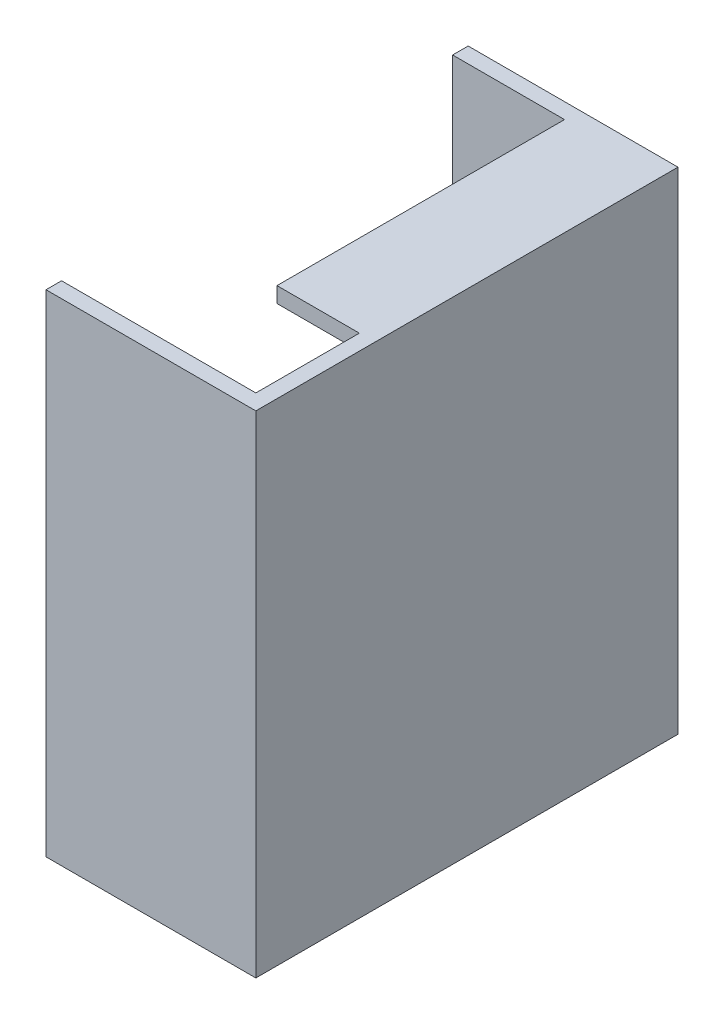
ISO-10303-21;
HEADER;
FILE_DESCRIPTION(('STEP AP214'),'2;1');
FILE_NAME('part.step','',(''),(''),'','','');
FILE_SCHEMA(('AUTOMOTIVE_DESIGN { 1 0 10303 214 1 1 1 1 }'));
ENDSEC;
DATA;
#1=APPLICATION_CONTEXT('core data for automotive mechanical design processes');
#2=APPLICATION_PROTOCOL_DEFINITION('international standard','automotive_design',2000,#1);
#3=PRODUCT_CONTEXT('',#1,'mechanical');
#4=PRODUCT('Part','Part','',(#3));
#5=PRODUCT_RELATED_PRODUCT_CATEGORY('part','',(#4));
#6=PRODUCT_DEFINITION_FORMATION('','',#4);
#7=PRODUCT_DEFINITION_CONTEXT('part definition',#1,'design');
#8=PRODUCT_DEFINITION('design','',#6,#7);
#9=PRODUCT_DEFINITION_SHAPE('','',#8);
#10=(LENGTH_UNIT() NAMED_UNIT(*) SI_UNIT(.MILLI.,.METRE.));
#11=(NAMED_UNIT(*) PLANE_ANGLE_UNIT() SI_UNIT($,.RADIAN.));
#12=(NAMED_UNIT(*) SI_UNIT($,.STERADIAN.) SOLID_ANGLE_UNIT());
#13=UNCERTAINTY_MEASURE_WITH_UNIT(LENGTH_MEASURE(1.E-05),#10,'distance_accuracy_value','');
#14=(GEOMETRIC_REPRESENTATION_CONTEXT(3) GLOBAL_UNCERTAINTY_ASSIGNED_CONTEXT((#13)) GLOBAL_UNIT_ASSIGNED_CONTEXT((#10,
#11,#12)) REPRESENTATION_CONTEXT('',''));
#15=CARTESIAN_POINT('',(0.,0.,0.));
#16=DIRECTION('',(0.,0.,1.));
#17=DIRECTION('',(1.,0.,0.));
#18=AXIS2_PLACEMENT_3D('',#15,#16,#17);
#19=CARTESIAN_POINT('',(0.,0.,0.));
#20=DIRECTION('',(1.,0.,0.));
#21=DIRECTION('',(0.,0.,-1.));
#22=AXIS2_PLACEMENT_3D('',#19,#20,#21);
#23=PLANE('',#22);
#24=DIRECTION('',(0.,0.,1.));
#25=VECTOR('',#24,1.);
#26=CARTESIAN_POINT('',(0.,38.735,0.));
#27=LINE('',#26,#25);
#28=CARTESIAN_POINT('',(0.,38.735,14.986));
#29=VERTEX_POINT('',#28);
#30=CARTESIAN_POINT('',(0.,38.735,31.903924));
#31=VERTEX_POINT('',#30);
#32=EDGE_CURVE('E305',#29,#31,#27,.T.);
#33=ORIENTED_EDGE('',*,*,#32,.F.);
#34=DIRECTION('',(0.,-1.,0.));
#35=VECTOR('',#34,1.);
#36=CARTESIAN_POINT('',(0.,0.,14.986));
#37=LINE('',#36,#35);
#38=CARTESIAN_POINT('',(0.,36.195,14.986));
#39=VERTEX_POINT('',#38);
#40=EDGE_CURVE('E229',#29,#39,#37,.T.);
#41=ORIENTED_EDGE('',*,*,#40,.T.);
#42=DIRECTION('',(0.,0.,-1.));
#43=VECTOR('',#42,1.);
#44=CARTESIAN_POINT('',(0.,36.195,0.));
#45=LINE('',#44,#43);
#46=CARTESIAN_POINT('',(0.,36.195,-32.004));
#47=VERTEX_POINT('',#46);
#48=EDGE_CURVE('E235',#39,#47,#45,.T.);
#49=ORIENTED_EDGE('',*,*,#48,.T.);
#50=DIRECTION('',(0.,-1.,0.));
#51=VECTOR('',#50,1.);
#52=CARTESIAN_POINT('',(0.,0.,-32.004));
#53=LINE('',#52,#51);
#54=CARTESIAN_POINT('',(0.,-38.989,-32.004));
#55=VERTEX_POINT('',#54);
#56=EDGE_CURVE('E255',#47,#55,#53,.T.);
#57=ORIENTED_EDGE('',*,*,#56,.T.);
#58=DIRECTION('',(0.,0.,-1.));
#59=VECTOR('',#58,1.);
#60=CARTESIAN_POINT('',(0.,-38.989,0.));
#61=LINE('',#60,#59);
#62=CARTESIAN_POINT('',(0.,-38.989,31.903924));
#63=VERTEX_POINT('',#62);
#64=EDGE_CURVE('E294',#63,#55,#61,.T.);
#65=ORIENTED_EDGE('',*,*,#64,.F.);
#66=DIRECTION('',(0.,-1.,0.));
#67=VECTOR('',#66,1.);
#68=CARTESIAN_POINT('',(0.,0.,31.903924));
#69=LINE('',#68,#67);
#70=EDGE_CURVE('E266',#31,#63,#69,.T.);
#71=ORIENTED_EDGE('',*,*,#70,.F.);
#72=EDGE_LOOP('',(#33,#41,#49,#57,#65,#71));
#73=FACE_BOUND('',#72,.T.);
#74=DIRECTION('',(0.,-1.,0.));
#75=VECTOR('',#74,1.);
#76=CARTESIAN_POINT('',(0.,-0.888999999999987,16.256));
#77=LINE('',#76,#75);
#78=CARTESIAN_POINT('',(0.,-0.888999999999987,16.256));
#79=VERTEX_POINT('',#78);
#80=CARTESIAN_POINT('',(0.,-32.639,16.256));
#81=VERTEX_POINT('',#80);
#82=EDGE_CURVE('E210',#79,#81,#77,.T.);
#83=ORIENTED_EDGE('',*,*,#82,.F.);
#84=DIRECTION('',(0.,0.,-1.));
#85=VECTOR('',#84,1.);
#86=CARTESIAN_POINT('',(0.,-0.888999999999987,16.256));
#87=LINE('',#86,#85);
#88=CARTESIAN_POINT('',(0.,-0.888999999999987,18.796));
#89=VERTEX_POINT('',#88);
#90=EDGE_CURVE('E209',#89,#79,#87,.T.);
#91=ORIENTED_EDGE('',*,*,#90,.F.);
#92=DIRECTION('',(0.,1.,0.));
#93=VECTOR('',#92,1.);
#94=CARTESIAN_POINT('',(0.,-0.888999999999987,18.796));
#95=LINE('',#94,#93);
#96=CARTESIAN_POINT('',(0.,-32.639,18.796));
#97=VERTEX_POINT('',#96);
#98=EDGE_CURVE('E67',#97,#89,#95,.T.);
#99=ORIENTED_EDGE('',*,*,#98,.F.);
#100=DIRECTION('',(0.,0.,1.));
#101=VECTOR('',#100,1.);
#102=CARTESIAN_POINT('',(0.,-32.639,16.256));
#103=LINE('',#102,#101);
#104=EDGE_CURVE('E62',#81,#97,#103,.T.);
#105=ORIENTED_EDGE('',*,*,#104,.F.);
#106=EDGE_LOOP('',(#83,#91,#99,#105));
#107=FACE_BOUND('',#106,.T.);
#108=ADVANCED_FACE('F46',(#73,#107),#23,.F.);
#109=CARTESIAN_POINT('',(2.54,0.,-34.544));
#110=DIRECTION('',(0.,0.,-1.));
#111=DIRECTION('',(0.,1.,0.));
#112=AXIS2_PLACEMENT_3D('',#109,#110,#111);
#113=PLANE('',#112);
#114=DIRECTION('',(-1.,0.,0.));
#115=VECTOR('',#114,1.);
#116=CARTESIAN_POINT('',(2.54,-41.529,-34.544));
#117=LINE('',#116,#115);
#118=CARTESIAN_POINT('',(2.54,-41.529,-34.544));
#119=VERTEX_POINT('',#118);
#120=CARTESIAN_POINT('',(-31.75,-41.529,-34.544));
#121=VERTEX_POINT('',#120);
#122=EDGE_CURVE('E331',#119,#121,#117,.T.);
#123=ORIENTED_EDGE('',*,*,#122,.T.);
#124=DIRECTION('',(0.,-1.,0.));
#125=VECTOR('',#124,1.);
#126=CARTESIAN_POINT('',(-31.75,0.,-34.544));
#127=LINE('',#126,#125);
#128=CARTESIAN_POINT('',(-31.75,38.735,-34.544));
#129=VERTEX_POINT('',#128);
#130=EDGE_CURVE('E287',#129,#121,#127,.T.);
#131=ORIENTED_EDGE('',*,*,#130,.F.);
#132=DIRECTION('',(-1.,0.,0.));
#133=VECTOR('',#132,1.);
#134=CARTESIAN_POINT('',(2.54,38.735,-34.544));
#135=LINE('',#134,#133);
#136=CARTESIAN_POINT('',(2.54,38.735,-34.544));
#137=VERTEX_POINT('',#136);
#138=EDGE_CURVE('E11',#137,#129,#135,.T.);
#139=ORIENTED_EDGE('',*,*,#138,.F.);
#140=DIRECTION('',(0.,-1.,0.));
#141=VECTOR('',#140,1.);
#142=CARTESIAN_POINT('',(2.54,0.,-34.544));
#143=LINE('',#142,#141);
#144=EDGE_CURVE('E317',#137,#119,#143,.T.);
#145=ORIENTED_EDGE('',*,*,#144,.T.);
#146=EDGE_LOOP('',(#123,#131,#139,#145));
#147=FACE_BOUND('',#146,.T.);
#148=ADVANCED_FACE('F48',(#147),#113,.T.);
#149=CARTESIAN_POINT('',(2.54,38.735,0.));
#150=DIRECTION('',(0.,-1.,0.));
#151=DIRECTION('',(0.,0.,-1.));
#152=AXIS2_PLACEMENT_3D('',#149,#150,#151);
#153=PLANE('',#152);
#154=DIRECTION('',(1.,0.,0.));
#155=VECTOR('',#154,1.);
#156=CARTESIAN_POINT('',(-13.462,38.735,14.986));
#157=LINE('',#156,#155);
#158=CARTESIAN_POINT('',(-13.462,38.735,14.986));
#159=VERTEX_POINT('',#158);
#160=EDGE_CURVE('E252',#159,#29,#157,.T.);
#161=ORIENTED_EDGE('',*,*,#160,.T.);
#162=ORIENTED_EDGE('',*,*,#32,.T.);
#163=DIRECTION('',(1.,0.,0.));
#164=VECTOR('',#163,1.);
#165=CARTESIAN_POINT('',(-31.75,38.735,31.903924));
#166=LINE('',#165,#164);
#167=CARTESIAN_POINT('',(-31.75,38.735,31.903924));
#168=VERTEX_POINT('',#167);
#169=EDGE_CURVE('E301',#168,#31,#166,.T.);
#170=ORIENTED_EDGE('',*,*,#169,.F.);
#171=DIRECTION('',(0.,0.,-1.));
#172=VECTOR('',#171,1.);
#173=CARTESIAN_POINT('',(-31.75,38.735,0.));
#174=LINE('',#173,#172);
#175=CARTESIAN_POINT('',(-31.75,38.735,34.443924));
#176=VERTEX_POINT('',#175);
#177=EDGE_CURVE('E276',#176,#168,#174,.T.);
#178=ORIENTED_EDGE('',*,*,#177,.F.);
#179=DIRECTION('',(-1.,0.,0.));
#180=VECTOR('',#179,1.);
#181=CARTESIAN_POINT('',(2.54,38.735,34.443924));
#182=LINE('',#181,#180);
#183=CARTESIAN_POINT('',(2.54,38.735,34.443924));
#184=VERTEX_POINT('',#183);
#185=EDGE_CURVE('E55',#184,#176,#182,.T.);
#186=ORIENTED_EDGE('',*,*,#185,.F.);
#187=DIRECTION('',(0.,0.,1.));
#188=VECTOR('',#187,1.);
#189=CARTESIAN_POINT('',(2.54,38.735,0.));
#190=LINE('',#189,#188);
#191=EDGE_CURVE('E321',#137,#184,#190,.T.);
#192=ORIENTED_EDGE('',*,*,#191,.F.);
#193=ORIENTED_EDGE('',*,*,#138,.T.);
#194=DIRECTION('',(0.,0.,-1.));
#195=VECTOR('',#194,1.);
#196=CARTESIAN_POINT('',(-31.75,38.735,0.));
#197=LINE('',#196,#195);
#198=CARTESIAN_POINT('',(-31.75,38.735,-32.004));
#199=VERTEX_POINT('',#198);
#200=EDGE_CURVE('E261',#199,#129,#197,.T.);
#201=ORIENTED_EDGE('',*,*,#200,.F.);
#202=DIRECTION('',(1.,0.,0.));
#203=VECTOR('',#202,1.);
#204=CARTESIAN_POINT('',(-31.75,38.735,-32.004));
#205=LINE('',#204,#203);
#206=CARTESIAN_POINT('',(-13.462,38.735,-32.004));
#207=VERTEX_POINT('',#206);
#208=EDGE_CURVE('E291',#199,#207,#205,.T.);
#209=ORIENTED_EDGE('',*,*,#208,.T.);
#210=DIRECTION('',(0.,0.,-1.));
#211=VECTOR('',#210,1.);
#212=CARTESIAN_POINT('',(-13.462,38.735,0.));
#213=LINE('',#212,#211);
#214=EDGE_CURVE('E242',#159,#207,#213,.T.);
#215=ORIENTED_EDGE('',*,*,#214,.F.);
#216=EDGE_LOOP('',(#161,#162,#170,#178,#186,#192,#193,#201,#209,#215));
#217=FACE_BOUND('',#216,.T.);
#218=ADVANCED_FACE('F351',(#217),#153,.F.);
#219=CARTESIAN_POINT('',(2.54,0.,34.443924));
#220=DIRECTION('',(0.,0.,1.));
#221=DIRECTION('',(1.,0.,0.));
#222=AXIS2_PLACEMENT_3D('',#219,#220,#221);
#223=PLANE('',#222);
#224=ORIENTED_EDGE('',*,*,#185,.T.);
#225=DIRECTION('',(0.,1.,0.));
#226=VECTOR('',#225,1.);
#227=CARTESIAN_POINT('',(-31.75,0.,34.443924));
#228=LINE('',#227,#226);
#229=CARTESIAN_POINT('',(-31.75,-41.529,34.443924));
#230=VERTEX_POINT('',#229);
#231=EDGE_CURVE('E279',#230,#176,#228,.T.);
#232=ORIENTED_EDGE('',*,*,#231,.F.);
#233=DIRECTION('',(-1.,0.,0.));
#234=VECTOR('',#233,1.);
#235=CARTESIAN_POINT('',(2.54,-41.529,34.443924));
#236=LINE('',#235,#234);
#237=CARTESIAN_POINT('',(2.54,-41.529,34.443924));
#238=VERTEX_POINT('',#237);
#239=EDGE_CURVE('E336',#238,#230,#236,.T.);
#240=ORIENTED_EDGE('',*,*,#239,.F.);
#241=DIRECTION('',(0.,1.,0.));
#242=VECTOR('',#241,1.);
#243=CARTESIAN_POINT('',(2.54,0.,34.443924));
#244=LINE('',#243,#242);
#245=EDGE_CURVE('E324',#238,#184,#244,.T.);
#246=ORIENTED_EDGE('',*,*,#245,.T.);
#247=EDGE_LOOP('',(#224,#232,#240,#246));
#248=FACE_BOUND('',#247,.T.);
#249=ADVANCED_FACE('F342',(#248),#223,.T.);
#250=CARTESIAN_POINT('',(2.54,-41.529,0.));
#251=DIRECTION('',(0.,1.,0.));
#252=DIRECTION('',(0.,0.,1.));
#253=AXIS2_PLACEMENT_3D('',#250,#251,#252);
#254=PLANE('',#253);
#255=ORIENTED_EDGE('',*,*,#239,.T.);
#256=DIRECTION('',(0.,0.,-1.));
#257=VECTOR('',#256,1.);
#258=CARTESIAN_POINT('',(-31.75,-41.529,0.));
#259=LINE('',#258,#257);
#260=EDGE_CURVE('E283',#230,#121,#259,.T.);
#261=ORIENTED_EDGE('',*,*,#260,.T.);
#262=ORIENTED_EDGE('',*,*,#122,.F.);
#263=DIRECTION('',(0.,0.,-1.));
#264=VECTOR('',#263,1.);
#265=CARTESIAN_POINT('',(2.54,-41.529,0.));
#266=LINE('',#265,#264);
#267=EDGE_CURVE('E328',#238,#119,#266,.T.);
#268=ORIENTED_EDGE('',*,*,#267,.F.);
#269=EDGE_LOOP('',(#255,#261,#262,#268));
#270=FACE_BOUND('',#269,.T.);
#271=ADVANCED_FACE('F374',(#270),#254,.F.);
#272=CARTESIAN_POINT('',(2.54,0.,0.));
#273=DIRECTION('',(1.,0.,0.));
#274=DIRECTION('',(0.,0.,-1.));
#275=AXIS2_PLACEMENT_3D('',#272,#273,#274);
#276=PLANE('',#275);
#277=ORIENTED_EDGE('',*,*,#144,.F.);
#278=ORIENTED_EDGE('',*,*,#191,.T.);
#279=ORIENTED_EDGE('',*,*,#245,.F.);
#280=ORIENTED_EDGE('',*,*,#267,.T.);
#281=EDGE_LOOP('',(#277,#278,#279,#280));
#282=FACE_BOUND('',#281,.T.);
#283=ADVANCED_FACE('F378',(#282),#276,.T.);
#284=CARTESIAN_POINT('',(-31.75,0.,31.903924));
#285=DIRECTION('',(0.,0.,1.));
#286=DIRECTION('',(0.,-1.,0.));
#287=AXIS2_PLACEMENT_3D('',#284,#285,#286);
#288=PLANE('',#287);
#289=ORIENTED_EDGE('',*,*,#70,.T.);
#290=DIRECTION('',(1.,0.,0.));
#291=VECTOR('',#290,1.);
#292=CARTESIAN_POINT('',(-31.75,-38.989,31.903924));
#293=LINE('',#292,#291);
#294=CARTESIAN_POINT('',(-31.75,-38.989,31.903924));
#295=VERTEX_POINT('',#294);
#296=EDGE_CURVE('E306',#295,#63,#293,.T.);
#297=ORIENTED_EDGE('',*,*,#296,.F.);
#298=DIRECTION('',(0.,-1.,0.));
#299=VECTOR('',#298,1.);
#300=CARTESIAN_POINT('',(-31.75,0.,31.903924));
#301=LINE('',#300,#299);
#302=EDGE_CURVE('E273',#168,#295,#301,.T.);
#303=ORIENTED_EDGE('',*,*,#302,.F.);
#304=ORIENTED_EDGE('',*,*,#169,.T.);
#305=EDGE_LOOP('',(#289,#297,#303,#304));
#306=FACE_BOUND('',#305,.T.);
#307=ADVANCED_FACE('F357',(#306),#288,.F.);
#308=CARTESIAN_POINT('',(-31.75,-38.989,0.));
#309=DIRECTION('',(0.,-1.,0.));
#310=DIRECTION('',(0.,0.,-1.));
#311=AXIS2_PLACEMENT_3D('',#308,#309,#310);
#312=PLANE('',#311);
#313=ORIENTED_EDGE('',*,*,#64,.T.);
#314=DIRECTION('',(1.,0.,0.));
#315=VECTOR('',#314,1.);
#316=CARTESIAN_POINT('',(-31.75,-38.989,-32.004));
#317=LINE('',#316,#315);
#318=CARTESIAN_POINT('',(-31.75,-38.989,-32.004));
#319=VERTEX_POINT('',#318);
#320=EDGE_CURVE('E310',#319,#55,#317,.T.);
#321=ORIENTED_EDGE('',*,*,#320,.F.);
#322=DIRECTION('',(0.,0.,-1.));
#323=VECTOR('',#322,1.);
#324=CARTESIAN_POINT('',(-31.75,-38.989,0.));
#325=LINE('',#324,#323);
#326=EDGE_CURVE('E270',#295,#319,#325,.T.);
#327=ORIENTED_EDGE('',*,*,#326,.F.);
#328=ORIENTED_EDGE('',*,*,#296,.T.);
#329=EDGE_LOOP('',(#313,#321,#327,#328));
#330=FACE_BOUND('',#329,.T.);
#331=ADVANCED_FACE('F362',(#330),#312,.F.);
#332=CARTESIAN_POINT('',(-31.75,0.,-32.004));
#333=DIRECTION('',(0.,0.,1.));
#334=DIRECTION('',(0.,-1.,0.));
#335=AXIS2_PLACEMENT_3D('',#332,#333,#334);
#336=PLANE('',#335);
#337=DIRECTION('',(1.,0.,0.));
#338=VECTOR('',#337,1.);
#339=CARTESIAN_POINT('',(-13.462,36.195,-32.004));
#340=LINE('',#339,#338);
#341=CARTESIAN_POINT('',(-13.462,36.195,-32.004));
#342=VERTEX_POINT('',#341);
#343=EDGE_CURVE('E256',#342,#47,#340,.T.);
#344=ORIENTED_EDGE('',*,*,#343,.F.);
#345=DIRECTION('',(0.,-1.,0.));
#346=VECTOR('',#345,1.);
#347=CARTESIAN_POINT('',(-13.462,0.,-32.004));
#348=LINE('',#347,#346);
#349=EDGE_CURVE('E239',#207,#342,#348,.T.);
#350=ORIENTED_EDGE('',*,*,#349,.F.);
#351=ORIENTED_EDGE('',*,*,#208,.F.);
#352=DIRECTION('',(0.,-1.,0.));
#353=VECTOR('',#352,1.);
#354=CARTESIAN_POINT('',(-31.75,0.,-32.004));
#355=LINE('',#354,#353);
#356=EDGE_CURVE('E265',#199,#319,#355,.T.);
#357=ORIENTED_EDGE('',*,*,#356,.T.);
#358=ORIENTED_EDGE('',*,*,#320,.T.);
#359=ORIENTED_EDGE('',*,*,#56,.F.);
#360=EDGE_LOOP('',(#344,#350,#351,#357,#358,#359));
#361=FACE_BOUND('',#360,.T.);
#362=ADVANCED_FACE('F366',(#361),#336,.T.);
#363=CARTESIAN_POINT('',(-31.75,0.,0.));
#364=DIRECTION('',(1.,0.,0.));
#365=DIRECTION('',(0.,0.,-1.));
#366=AXIS2_PLACEMENT_3D('',#363,#364,#365);
#367=PLANE('',#366);
#368=ORIENTED_EDGE('',*,*,#200,.T.);
#369=ORIENTED_EDGE('',*,*,#130,.T.);
#370=ORIENTED_EDGE('',*,*,#260,.F.);
#371=ORIENTED_EDGE('',*,*,#231,.T.);
#372=ORIENTED_EDGE('',*,*,#177,.T.);
#373=ORIENTED_EDGE('',*,*,#302,.T.);
#374=ORIENTED_EDGE('',*,*,#326,.T.);
#375=ORIENTED_EDGE('',*,*,#356,.F.);
#376=EDGE_LOOP('',(#368,#369,#370,#371,#372,#373,#374,#375));
#377=FACE_BOUND('',#376,.T.);
#378=ADVANCED_FACE('F349',(#377),#367,.F.);
#379=CARTESIAN_POINT('',(-13.462,0.,14.986));
#380=DIRECTION('',(0.,0.,1.));
#381=DIRECTION('',(1.,0.,0.));
#382=AXIS2_PLACEMENT_3D('',#379,#380,#381);
#383=PLANE('',#382);
#384=ORIENTED_EDGE('',*,*,#40,.F.);
#385=ORIENTED_EDGE('',*,*,#160,.F.);
#386=DIRECTION('',(0.,-1.,0.));
#387=VECTOR('',#386,1.);
#388=CARTESIAN_POINT('',(-13.462,0.,14.986));
#389=LINE('',#388,#387);
#390=CARTESIAN_POINT('',(-13.462,36.195,14.986));
#391=VERTEX_POINT('',#390);
#392=EDGE_CURVE('E230',#159,#391,#389,.T.);
#393=ORIENTED_EDGE('',*,*,#392,.T.);
#394=DIRECTION('',(1.,0.,0.));
#395=VECTOR('',#394,1.);
#396=CARTESIAN_POINT('',(-13.462,36.195,14.986));
#397=LINE('',#396,#395);
#398=EDGE_CURVE('E245',#391,#39,#397,.T.);
#399=ORIENTED_EDGE('',*,*,#398,.T.);
#400=EDGE_LOOP('',(#384,#385,#393,#399));
#401=FACE_BOUND('',#400,.T.);
#402=ADVANCED_FACE('F425',(#401),#383,.T.);
#403=CARTESIAN_POINT('',(-13.462,36.195,0.));
#404=DIRECTION('',(0.,-1.,0.));
#405=DIRECTION('',(0.,0.,-1.));
#406=AXIS2_PLACEMENT_3D('',#403,#404,#405);
#407=PLANE('',#406);
#408=ORIENTED_EDGE('',*,*,#48,.F.);
#409=ORIENTED_EDGE('',*,*,#398,.F.);
#410=DIRECTION('',(0.,0.,-1.));
#411=VECTOR('',#410,1.);
#412=CARTESIAN_POINT('',(-13.462,36.195,0.));
#413=LINE('',#412,#411);
#414=EDGE_CURVE('E234',#391,#342,#413,.T.);
#415=ORIENTED_EDGE('',*,*,#414,.T.);
#416=ORIENTED_EDGE('',*,*,#343,.T.);
#417=EDGE_LOOP('',(#408,#409,#415,#416));
#418=FACE_BOUND('',#417,.T.);
#419=ADVANCED_FACE('F444',(#418),#407,.T.);
#420=CARTESIAN_POINT('',(-13.462,0.,0.));
#421=DIRECTION('',(1.,0.,0.));
#422=DIRECTION('',(0.,0.,-1.));
#423=AXIS2_PLACEMENT_3D('',#420,#421,#422);
#424=PLANE('',#423);
#425=ORIENTED_EDGE('',*,*,#392,.F.);
#426=ORIENTED_EDGE('',*,*,#214,.T.);
#427=ORIENTED_EDGE('',*,*,#349,.T.);
#428=ORIENTED_EDGE('',*,*,#414,.F.);
#429=EDGE_LOOP('',(#425,#426,#427,#428));
#430=FACE_BOUND('',#429,.T.);
#431=ADVANCED_FACE('F452',(#430),#424,.F.);
#432=CARTESIAN_POINT('',(-34.29,-0.888999999999987,16.256));
#433=DIRECTION('',(0.,0.,1.));
#434=DIRECTION('',(0.,-1.,0.));
#435=AXIS2_PLACEMENT_3D('',#432,#433,#434);
#436=PLANE('',#435);
#437=ORIENTED_EDGE('',*,*,#82,.T.);
#438=DIRECTION('',(1.,0.,0.));
#439=VECTOR('',#438,1.);
#440=CARTESIAN_POINT('',(-34.29,-32.639,16.256));
#441=LINE('',#440,#439);
#442=CARTESIAN_POINT('',(-34.29,-32.639,16.256));
#443=VERTEX_POINT('',#442);
#444=EDGE_CURVE('E172',#443,#81,#441,.T.);
#445=ORIENTED_EDGE('',*,*,#444,.F.);
#446=DIRECTION('',(0.,-1.,0.));
#447=VECTOR('',#446,1.);
#448=CARTESIAN_POINT('',(-34.29,-0.888999999999987,16.256));
#449=LINE('',#448,#447);
#450=CARTESIAN_POINT('',(-34.29,-0.888999999999987,16.256));
#451=VERTEX_POINT('',#450);
#452=EDGE_CURVE('E204',#451,#443,#449,.T.);
#453=ORIENTED_EDGE('',*,*,#452,.F.);
#454=DIRECTION('',(1.,0.,0.));
#455=VECTOR('',#454,1.);
#456=CARTESIAN_POINT('',(-34.29,-0.888999999999987,16.256));
#457=LINE('',#456,#455);
#458=EDGE_CURVE('E208',#451,#79,#457,.T.);
#459=ORIENTED_EDGE('',*,*,#458,.T.);
#460=EDGE_LOOP('',(#437,#445,#453,#459));
#461=FACE_BOUND('',#460,.T.);
#462=ADVANCED_FACE('F460',(#461),#436,.F.);
#463=CARTESIAN_POINT('',(-34.29,-32.639,16.256));
#464=DIRECTION('',(0.,1.,0.));
#465=DIRECTION('',(0.,0.,1.));
#466=AXIS2_PLACEMENT_3D('',#463,#464,#465);
#467=PLANE('',#466);
#468=ORIENTED_EDGE('',*,*,#104,.T.);
#469=DIRECTION('',(1.,0.,0.));
#470=VECTOR('',#469,1.);
#471=CARTESIAN_POINT('',(-34.29,-32.639,18.796));
#472=LINE('',#471,#470);
#473=CARTESIAN_POINT('',(-40.0863280259255,-32.639,18.796));
#474=VERTEX_POINT('',#473);
#475=EDGE_CURVE('E163',#474,#97,#472,.T.);
#476=ORIENTED_EDGE('',*,*,#475,.F.);
#477=CARTESIAN_POINT('',(-40.0863280259255,-32.639,18.161));
#478=DIRECTION('',(0.,-1.,0.));
#479=DIRECTION('',(0.,0.,-1.));
#480=AXIS2_PLACEMENT_3D('',#477,#478,#479);
#481=CIRCLE('',#480,0.634999999999999);
#482=CARTESIAN_POINT('',(-40.4274772285745,-32.639,17.6254234680908));
#483=VERTEX_POINT('',#482);
#484=EDGE_CURVE('E168',#474,#483,#481,.T.);
#485=ORIENTED_EDGE('',*,*,#484,.T.);
#486=DIRECTION('',(0.843427609305906,0.,-0.537242838817348));
#487=VECTOR('',#486,1.);
#488=CARTESIAN_POINT('',(-40.4274772285745,-32.639,17.6254234680908));
#489=LINE('',#488,#487);
#490=CARTESIAN_POINT('',(-34.29,-32.639,13.716));
#491=VERTEX_POINT('',#490);
#492=EDGE_CURVE('E184',#483,#491,#489,.T.);
#493=ORIENTED_EDGE('',*,*,#492,.T.);
#494=DIRECTION('',(0.,0.,1.));
#495=VECTOR('',#494,1.);
#496=CARTESIAN_POINT('',(-34.29,-32.639,18.796));
#497=LINE('',#496,#495);
#498=EDGE_CURVE('E189',#491,#443,#497,.T.);
#499=ORIENTED_EDGE('',*,*,#498,.T.);
#500=ORIENTED_EDGE('',*,*,#444,.T.);
#501=EDGE_LOOP('',(#468,#476,#485,#493,#499,#500));
#502=FACE_BOUND('',#501,.T.);
#503=ADVANCED_FACE('F165',(#502),#467,.F.);
#504=CARTESIAN_POINT('',(-34.29,-0.888999999999987,18.796));
#505=DIRECTION('',(0.,0.,-1.));
#506=DIRECTION('',(0.,1.,0.));
#507=AXIS2_PLACEMENT_3D('',#504,#505,#506);
#508=PLANE('',#507);
#509=ORIENTED_EDGE('',*,*,#98,.T.);
#510=DIRECTION('',(1.,0.,0.));
#511=VECTOR('',#510,1.);
#512=CARTESIAN_POINT('',(-34.29,-0.888999999999987,18.796));
#513=LINE('',#512,#511);
#514=CARTESIAN_POINT('',(-40.0863280259255,-0.888999999999987,18.796));
#515=VERTEX_POINT('',#514);
#516=EDGE_CURVE('E173',#515,#89,#513,.T.);
#517=ORIENTED_EDGE('',*,*,#516,.F.);
#518=DIRECTION('',(0.,-1.,0.));
#519=VECTOR('',#518,1.);
#520=CARTESIAN_POINT('',(-40.0863280259255,7.30663177412545,18.796));
#521=LINE('',#520,#519);
#522=EDGE_CURVE('E176',#515,#474,#521,.T.);
#523=ORIENTED_EDGE('',*,*,#522,.T.);
#524=ORIENTED_EDGE('',*,*,#475,.T.);
#525=EDGE_LOOP('',(#509,#517,#523,#524));
#526=FACE_BOUND('',#525,.T.);
#527=ADVANCED_FACE('F177',(#526),#508,.F.);
#528=CARTESIAN_POINT('',(-34.29,-0.888999999999987,16.256));
#529=DIRECTION('',(0.,-1.,0.));
#530=DIRECTION('',(0.,0.,-1.));
#531=AXIS2_PLACEMENT_3D('',#528,#529,#530);
#532=PLANE('',#531);
#533=ORIENTED_EDGE('',*,*,#90,.T.);
#534=ORIENTED_EDGE('',*,*,#458,.F.);
#535=DIRECTION('',(0.,0.,-1.));
#536=VECTOR('',#535,1.);
#537=CARTESIAN_POINT('',(-34.29,-0.888999999999987,18.796));
#538=LINE('',#537,#536);
#539=CARTESIAN_POINT('',(-34.29,-0.888999999999987,13.716));
#540=VERTEX_POINT('',#539);
#541=EDGE_CURVE('E214',#451,#540,#538,.T.);
#542=ORIENTED_EDGE('',*,*,#541,.T.);
#543=DIRECTION('',(-0.843427609305906,0.,0.537242838817348));
#544=VECTOR('',#543,1.);
#545=CARTESIAN_POINT('',(-40.4274772285745,-0.888999999999987,17.6254234680908));
#546=LINE('',#545,#544);
#547=CARTESIAN_POINT('',(-40.4274772285745,-0.888999999999987,17.6254234680908));
#548=VERTEX_POINT('',#547);
#549=EDGE_CURVE('E547',#540,#548,#546,.T.);
#550=ORIENTED_EDGE('',*,*,#549,.T.);
#551=CARTESIAN_POINT('',(-40.0863280259255,-0.888999999999987,18.161));
#552=DIRECTION('',(0.,-1.,0.));
#553=DIRECTION('',(0.,0.,-1.));
#554=AXIS2_PLACEMENT_3D('',#551,#552,#553);
#555=CIRCLE('',#554,0.634999999999999);
#556=EDGE_CURVE('E201',#548,#515,#555,.F.);
#557=ORIENTED_EDGE('',*,*,#556,.T.);
#558=ORIENTED_EDGE('',*,*,#516,.T.);
#559=EDGE_LOOP('',(#533,#534,#542,#550,#557,#558));
#560=FACE_BOUND('',#559,.T.);
#561=ADVANCED_FACE('F502',(#560),#532,.F.);
#562=CARTESIAN_POINT('',(-34.29,7.30663177412545,18.796));
#563=DIRECTION('',(1.,0.,0.));
#564=DIRECTION('',(0.,0.,-1.));
#565=AXIS2_PLACEMENT_3D('',#562,#563,#564);
#566=PLANE('',#565);
#567=ORIENTED_EDGE('',*,*,#541,.F.);
#568=ORIENTED_EDGE('',*,*,#452,.T.);
#569=ORIENTED_EDGE('',*,*,#498,.F.);
#570=DIRECTION('',(0.,-1.,0.));
#571=VECTOR('',#570,1.);
#572=CARTESIAN_POINT('',(-34.29,7.30663177412545,13.716));
#573=LINE('',#572,#571);
#574=EDGE_CURVE('E198',#540,#491,#573,.T.);
#575=ORIENTED_EDGE('',*,*,#574,.F.);
#576=EDGE_LOOP('',(#567,#568,#569,#575));
#577=FACE_BOUND('',#576,.T.);
#578=ADVANCED_FACE('F512',(#577),#566,.T.);
#579=CARTESIAN_POINT('',(-40.4274772285745,7.30663177412545,17.6254234680908));
#580=DIRECTION('',(-0.537242838817348,0.,-0.843427609305906));
#581=DIRECTION('',(-0.843427609305906,0.,0.537242838817348));
#582=AXIS2_PLACEMENT_3D('',#579,#580,#581);
#583=PLANE('',#582);
#584=ORIENTED_EDGE('',*,*,#549,.F.);
#585=ORIENTED_EDGE('',*,*,#574,.T.);
#586=ORIENTED_EDGE('',*,*,#492,.F.);
#587=DIRECTION('',(0.,-1.,0.));
#588=VECTOR('',#587,1.);
#589=CARTESIAN_POINT('',(-40.4274772285745,7.30663177412545,17.6254234680908));
#590=LINE('',#589,#588);
#591=EDGE_CURVE('E183',#548,#483,#590,.T.);
#592=ORIENTED_EDGE('',*,*,#591,.F.);
#593=EDGE_LOOP('',(#584,#585,#586,#592));
#594=FACE_BOUND('',#593,.T.);
#595=ADVANCED_FACE('F525',(#594),#583,.T.);
#596=CARTESIAN_POINT('',(-40.0863280259255,7.30663177412545,18.161));
#597=DIRECTION('',(0.,-1.,0.));
#598=DIRECTION('',(0.,0.,-1.));
#599=AXIS2_PLACEMENT_3D('',#596,#597,#598);
#600=CYLINDRICAL_SURFACE('',#599,0.634999999999999);
#601=ORIENTED_EDGE('',*,*,#556,.F.);
#602=ORIENTED_EDGE('',*,*,#591,.T.);
#603=ORIENTED_EDGE('',*,*,#484,.F.);
#604=ORIENTED_EDGE('',*,*,#522,.F.);
#605=EDGE_LOOP('',(#601,#602,#603,#604));
#606=FACE_BOUND('',#605,.T.);
#607=ADVANCED_FACE('F186',(#606),#600,.T.);
#608=CLOSED_SHELL('',(#108,#148,#218,#249,#271,#283,#307,#331,#362,#378,#402,#419,#431,#462,
#503,#527,#561,#578,#595,#607));
#609=MANIFOLD_SOLID_BREP('B2',#608);
#610=ADVANCED_BREP_SHAPE_REPRESENTATION('',(#18,#609),#14);
#611=SHAPE_DEFINITION_REPRESENTATION(#9,#610);
ENDSEC;
END-ISO-10303-21;
